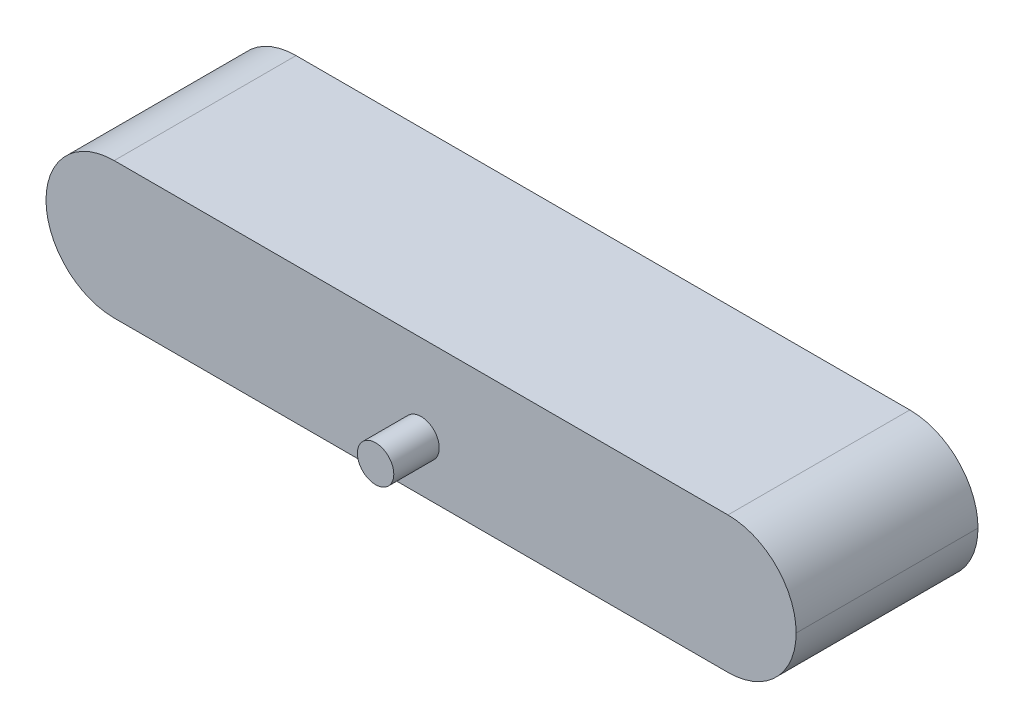
ISO-10303-21;
HEADER;
FILE_DESCRIPTION(('STEP AP214'),'2;1');
FILE_NAME('part.step','',(''),(''),'','','');
FILE_SCHEMA(('AUTOMOTIVE_DESIGN { 1 0 10303 214 1 1 1 1 }'));
ENDSEC;
DATA;
#1=APPLICATION_CONTEXT('core data for automotive mechanical design processes');
#2=APPLICATION_PROTOCOL_DEFINITION('international standard','automotive_design',2000,#1);
#3=PRODUCT_CONTEXT('',#1,'mechanical');
#4=PRODUCT('Part','Part','',(#3));
#5=PRODUCT_RELATED_PRODUCT_CATEGORY('part','',(#4));
#6=PRODUCT_DEFINITION_FORMATION('','',#4);
#7=PRODUCT_DEFINITION_CONTEXT('part definition',#1,'design');
#8=PRODUCT_DEFINITION('design','',#6,#7);
#9=PRODUCT_DEFINITION_SHAPE('','',#8);
#10=(LENGTH_UNIT() NAMED_UNIT(*) SI_UNIT(.MILLI.,.METRE.));
#11=(NAMED_UNIT(*) PLANE_ANGLE_UNIT() SI_UNIT($,.RADIAN.));
#12=(NAMED_UNIT(*) SI_UNIT($,.STERADIAN.) SOLID_ANGLE_UNIT());
#13=UNCERTAINTY_MEASURE_WITH_UNIT(LENGTH_MEASURE(1.E-05),#10,'distance_accuracy_value','');
#14=(GEOMETRIC_REPRESENTATION_CONTEXT(3) GLOBAL_UNCERTAINTY_ASSIGNED_CONTEXT((#13)) GLOBAL_UNIT_ASSIGNED_CONTEXT((#10,
#11,#12)) REPRESENTATION_CONTEXT('',''));
#15=CARTESIAN_POINT('',(0.,0.,0.));
#16=DIRECTION('',(0.,0.,1.));
#17=DIRECTION('',(1.,0.,0.));
#18=AXIS2_PLACEMENT_3D('',#15,#16,#17);
#19=CARTESIAN_POINT('',(82.5,-15.,40.));
#20=DIRECTION('',(0.,1.,0.));
#21=DIRECTION('',(-1.,0.,0.));
#22=AXIS2_PLACEMENT_3D('',#19,#20,#21);
#23=PLANE('',#22);
#24=DIRECTION('',(1.,0.,0.));
#25=VECTOR('',#24,1.);
#26=CARTESIAN_POINT('',(82.5,-15.,0.));
#27=LINE('',#26,#25);
#28=CARTESIAN_POINT('',(-67.5,-15.,0.));
#29=VERTEX_POINT('',#28);
#30=CARTESIAN_POINT('',(67.5,-15.,0.));
#31=VERTEX_POINT('',#30);
#32=EDGE_CURVE('E148',#29,#31,#27,.T.);
#33=ORIENTED_EDGE('',*,*,#32,.T.);
#34=DIRECTION('',(0.,0.,-1.));
#35=VECTOR('',#34,1.);
#36=CARTESIAN_POINT('',(67.5,-15.,40.));
#37=LINE('',#36,#35);
#38=CARTESIAN_POINT('',(67.5,-15.,40.));
#39=VERTEX_POINT('',#38);
#40=EDGE_CURVE('E11',#31,#39,#37,.F.);
#41=ORIENTED_EDGE('',*,*,#40,.T.);
#42=DIRECTION('',(1.,0.,0.));
#43=VECTOR('',#42,1.);
#44=CARTESIAN_POINT('',(82.5,-15.,40.));
#45=LINE('',#44,#43);
#46=CARTESIAN_POINT('',(-67.5,-15.,40.));
#47=VERTEX_POINT('',#46);
#48=EDGE_CURVE('E140',#47,#39,#45,.T.);
#49=ORIENTED_EDGE('',*,*,#48,.F.);
#50=DIRECTION('',(0.,0.,-1.));
#51=VECTOR('',#50,1.);
#52=CARTESIAN_POINT('',(-67.5,-15.,40.));
#53=LINE('',#52,#51);
#54=EDGE_CURVE('E42',#47,#29,#53,.T.);
#55=ORIENTED_EDGE('',*,*,#54,.T.);
#56=EDGE_LOOP('',(#33,#41,#49,#55));
#57=FACE_BOUND('',#56,.T.);
#58=DIRECTION('',(0.,0.,-1.));
#59=VECTOR('',#58,1.);
#60=CARTESIAN_POINT('',(-13.,-15.,7.00000000000001));
#61=LINE('',#60,#59);
#62=CARTESIAN_POINT('',(-13.,-15.,14.));
#63=VERTEX_POINT('',#62);
#64=CARTESIAN_POINT('',(-13.,-15.,7.00000000000001));
#65=VERTEX_POINT('',#64);
#66=EDGE_CURVE('E132',#63,#65,#61,.T.);
#67=ORIENTED_EDGE('',*,*,#66,.F.);
#68=DIRECTION('',(-1.,0.,0.));
#69=VECTOR('',#68,1.);
#70=CARTESIAN_POINT('',(13.,-15.,14.));
#71=LINE('',#70,#69);
#72=CARTESIAN_POINT('',(13.,-15.,14.));
#73=VERTEX_POINT('',#72);
#74=EDGE_CURVE('E129',#73,#63,#71,.T.);
#75=ORIENTED_EDGE('',*,*,#74,.F.);
#76=DIRECTION('',(0.,0.,1.));
#77=VECTOR('',#76,1.);
#78=CARTESIAN_POINT('',(13.,-15.,7.00000000000001));
#79=LINE('',#78,#77);
#80=CARTESIAN_POINT('',(13.,-15.,7.00000000000001));
#81=VERTEX_POINT('',#80);
#82=EDGE_CURVE('E55',#81,#73,#79,.T.);
#83=ORIENTED_EDGE('',*,*,#82,.F.);
#84=DIRECTION('',(1.,0.,0.));
#85=VECTOR('',#84,1.);
#86=CARTESIAN_POINT('',(13.,-15.,7.00000000000001));
#87=LINE('',#86,#85);
#88=EDGE_CURVE('E50',#65,#81,#87,.T.);
#89=ORIENTED_EDGE('',*,*,#88,.F.);
#90=EDGE_LOOP('',(#67,#75,#83,#89));
#91=FACE_BOUND('',#90,.T.);
#92=ADVANCED_FACE('F33',(#57,#91),#23,.F.);
#93=CARTESIAN_POINT('',(82.5,15.,40.));
#94=DIRECTION('',(0.,-1.,0.));
#95=DIRECTION('',(0.,0.,-1.));
#96=AXIS2_PLACEMENT_3D('',#93,#94,#95);
#97=PLANE('',#96);
#98=DIRECTION('',(-1.,0.,0.));
#99=VECTOR('',#98,1.);
#100=CARTESIAN_POINT('',(82.5,15.,0.));
#101=LINE('',#100,#99);
#102=CARTESIAN_POINT('',(67.5,15.,0.));
#103=VERTEX_POINT('',#102);
#104=CARTESIAN_POINT('',(-67.5,15.,0.));
#105=VERTEX_POINT('',#104);
#106=EDGE_CURVE('E144',#103,#105,#101,.T.);
#107=ORIENTED_EDGE('',*,*,#106,.T.);
#108=DIRECTION('',(0.,0.,-1.));
#109=VECTOR('',#108,1.);
#110=CARTESIAN_POINT('',(-67.5,15.,40.));
#111=LINE('',#110,#109);
#112=CARTESIAN_POINT('',(-67.5,15.,40.));
#113=VERTEX_POINT('',#112);
#114=EDGE_CURVE('E162',#105,#113,#111,.F.);
#115=ORIENTED_EDGE('',*,*,#114,.T.);
#116=DIRECTION('',(-1.,0.,0.));
#117=VECTOR('',#116,1.);
#118=CARTESIAN_POINT('',(82.5,15.,40.));
#119=LINE('',#118,#117);
#120=CARTESIAN_POINT('',(67.5,15.,40.));
#121=VERTEX_POINT('',#120);
#122=EDGE_CURVE('E143',#121,#113,#119,.T.);
#123=ORIENTED_EDGE('',*,*,#122,.F.);
#124=DIRECTION('',(0.,0.,-1.));
#125=VECTOR('',#124,1.);
#126=CARTESIAN_POINT('',(67.5,15.,40.));
#127=LINE('',#126,#125);
#128=EDGE_CURVE('E160',#121,#103,#127,.T.);
#129=ORIENTED_EDGE('',*,*,#128,.T.);
#130=EDGE_LOOP('',(#107,#115,#123,#129));
#131=FACE_BOUND('',#130,.T.);
#132=ADVANCED_FACE('F201',(#131),#97,.F.);
#133=CARTESIAN_POINT('',(0.,0.,40.));
#134=DIRECTION('',(0.,0.,1.));
#135=DIRECTION('',(1.,0.,0.));
#136=AXIS2_PLACEMENT_3D('',#133,#134,#135);
#137=PLANE('',#136);
#138=CARTESIAN_POINT('',(0.,-4.,40.));
#139=DIRECTION('',(0.,0.,1.));
#140=DIRECTION('',(1.,0.,0.));
#141=AXIS2_PLACEMENT_3D('',#138,#139,#140);
#142=CIRCLE('',#141,4.);
#143=CARTESIAN_POINT('',(4.,-4.,40.));
#144=VERTEX_POINT('',#143);
#145=EDGE_CURVE('E345',#144,#144,#142,.T.);
#146=ORIENTED_EDGE('',*,*,#145,.F.);
#147=EDGE_LOOP('',(#146));
#148=FACE_BOUND('',#147,.T.);
#149=ORIENTED_EDGE('',*,*,#122,.T.);
#150=CARTESIAN_POINT('',(-67.5,0.,40.));
#151=DIRECTION('',(0.,0.,1.));
#152=DIRECTION('',(1.,0.,0.));
#153=AXIS2_PLACEMENT_3D('',#150,#151,#152);
#154=CIRCLE('',#153,15.);
#155=CARTESIAN_POINT('',(-82.5,0.,40.));
#156=VERTEX_POINT('',#155);
#157=EDGE_CURVE('E171',#113,#156,#154,.T.);
#158=ORIENTED_EDGE('',*,*,#157,.T.);
#159=CARTESIAN_POINT('',(-67.5,0.,40.));
#160=DIRECTION('',(0.,0.,1.));
#161=DIRECTION('',(1.,0.,0.));
#162=AXIS2_PLACEMENT_3D('',#159,#160,#161);
#163=CIRCLE('',#162,15.);
#164=EDGE_CURVE('E169',#156,#47,#163,.T.);
#165=ORIENTED_EDGE('',*,*,#164,.T.);
#166=ORIENTED_EDGE('',*,*,#48,.T.);
#167=CARTESIAN_POINT('',(67.5,0.,40.));
#168=DIRECTION('',(0.,0.,1.));
#169=DIRECTION('',(1.,0.,0.));
#170=AXIS2_PLACEMENT_3D('',#167,#168,#169);
#171=CIRCLE('',#170,15.);
#172=CARTESIAN_POINT('',(82.5,0.,40.));
#173=VERTEX_POINT('',#172);
#174=EDGE_CURVE('E167',#39,#173,#171,.T.);
#175=ORIENTED_EDGE('',*,*,#174,.T.);
#176=CARTESIAN_POINT('',(67.5,0.,40.));
#177=DIRECTION('',(0.,0.,1.));
#178=DIRECTION('',(1.,0.,0.));
#179=AXIS2_PLACEMENT_3D('',#176,#177,#178);
#180=CIRCLE('',#179,15.);
#181=EDGE_CURVE('E165',#173,#121,#180,.T.);
#182=ORIENTED_EDGE('',*,*,#181,.T.);
#183=EDGE_LOOP('',(#149,#158,#165,#166,#175,#182));
#184=FACE_BOUND('',#183,.T.);
#185=ADVANCED_FACE('F186',(#148,#184),#137,.T.);
#186=CARTESIAN_POINT('',(0.,0.,0.));
#187=DIRECTION('',(0.,0.,1.));
#188=DIRECTION('',(1.,0.,0.));
#189=AXIS2_PLACEMENT_3D('',#186,#187,#188);
#190=PLANE('',#189);
#191=CARTESIAN_POINT('',(-67.5,0.,0.));
#192=DIRECTION('',(0.,0.,1.));
#193=DIRECTION('',(1.,0.,0.));
#194=AXIS2_PLACEMENT_3D('',#191,#192,#193);
#195=CIRCLE('',#194,15.);
#196=CARTESIAN_POINT('',(-82.5,0.,0.));
#197=VERTEX_POINT('',#196);
#198=EDGE_CURVE('E156',#29,#197,#195,.F.);
#199=ORIENTED_EDGE('',*,*,#198,.T.);
#200=CARTESIAN_POINT('',(-67.5,0.,0.));
#201=DIRECTION('',(0.,0.,1.));
#202=DIRECTION('',(1.,0.,0.));
#203=AXIS2_PLACEMENT_3D('',#200,#201,#202);
#204=CIRCLE('',#203,15.);
#205=EDGE_CURVE('E158',#197,#105,#204,.F.);
#206=ORIENTED_EDGE('',*,*,#205,.T.);
#207=ORIENTED_EDGE('',*,*,#106,.F.);
#208=CARTESIAN_POINT('',(67.5,0.,0.));
#209=DIRECTION('',(0.,0.,1.));
#210=DIRECTION('',(1.,0.,0.));
#211=AXIS2_PLACEMENT_3D('',#208,#209,#210);
#212=CIRCLE('',#211,15.);
#213=CARTESIAN_POINT('',(82.5,0.,0.));
#214=VERTEX_POINT('',#213);
#215=EDGE_CURVE('E147',#103,#214,#212,.F.);
#216=ORIENTED_EDGE('',*,*,#215,.T.);
#217=CARTESIAN_POINT('',(67.5,0.,0.));
#218=DIRECTION('',(0.,0.,1.));
#219=DIRECTION('',(1.,0.,0.));
#220=AXIS2_PLACEMENT_3D('',#217,#218,#219);
#221=CIRCLE('',#220,15.);
#222=EDGE_CURVE('E154',#214,#31,#221,.F.);
#223=ORIENTED_EDGE('',*,*,#222,.T.);
#224=ORIENTED_EDGE('',*,*,#32,.F.);
#225=EDGE_LOOP('',(#199,#206,#207,#216,#223,#224));
#226=FACE_BOUND('',#225,.T.);
#227=ADVANCED_FACE('F203',(#226),#190,.F.);
#228=CARTESIAN_POINT('',(-67.5,0.,40.));
#229=DIRECTION('',(0.,0.,-1.));
#230=DIRECTION('',(-1.,0.,0.));
#231=AXIS2_PLACEMENT_3D('',#228,#229,#230);
#232=CYLINDRICAL_SURFACE('',#231,15.);
#233=ORIENTED_EDGE('',*,*,#54,.F.);
#234=ORIENTED_EDGE('',*,*,#164,.F.);
#235=DIRECTION('',(0.,0.,-1.));
#236=VECTOR('',#235,1.);
#237=CARTESIAN_POINT('',(-82.5,0.,40.));
#238=LINE('',#237,#236);
#239=EDGE_CURVE('E135',#197,#156,#238,.F.);
#240=ORIENTED_EDGE('',*,*,#239,.F.);
#241=ORIENTED_EDGE('',*,*,#198,.F.);
#242=EDGE_LOOP('',(#233,#234,#240,#241));
#243=FACE_BOUND('',#242,.T.);
#244=ADVANCED_FACE('F183',(#243),#232,.T.);
#245=CARTESIAN_POINT('',(-67.5,0.,40.));
#246=DIRECTION('',(0.,0.,-1.));
#247=DIRECTION('',(-1.,0.,0.));
#248=AXIS2_PLACEMENT_3D('',#245,#246,#247);
#249=CYLINDRICAL_SURFACE('',#248,15.);
#250=ORIENTED_EDGE('',*,*,#157,.F.);
#251=ORIENTED_EDGE('',*,*,#114,.F.);
#252=ORIENTED_EDGE('',*,*,#205,.F.);
#253=ORIENTED_EDGE('',*,*,#239,.T.);
#254=EDGE_LOOP('',(#250,#251,#252,#253));
#255=FACE_BOUND('',#254,.T.);
#256=ADVANCED_FACE('F177',(#255),#249,.T.);
#257=CARTESIAN_POINT('',(67.5,0.,40.));
#258=DIRECTION('',(0.,0.,-1.));
#259=DIRECTION('',(-1.,0.,0.));
#260=AXIS2_PLACEMENT_3D('',#257,#258,#259);
#261=CYLINDRICAL_SURFACE('',#260,15.);
#262=ORIENTED_EDGE('',*,*,#128,.F.);
#263=ORIENTED_EDGE('',*,*,#181,.F.);
#264=DIRECTION('',(0.,0.,-1.));
#265=VECTOR('',#264,1.);
#266=CARTESIAN_POINT('',(82.5,0.,40.));
#267=LINE('',#266,#265);
#268=EDGE_CURVE('E37',#214,#173,#267,.F.);
#269=ORIENTED_EDGE('',*,*,#268,.F.);
#270=ORIENTED_EDGE('',*,*,#215,.F.);
#271=EDGE_LOOP('',(#262,#263,#269,#270));
#272=FACE_BOUND('',#271,.T.);
#273=ADVANCED_FACE('F35',(#272),#261,.T.);
#274=CARTESIAN_POINT('',(67.5,0.,40.));
#275=DIRECTION('',(0.,0.,-1.));
#276=DIRECTION('',(-1.,0.,0.));
#277=AXIS2_PLACEMENT_3D('',#274,#275,#276);
#278=CYLINDRICAL_SURFACE('',#277,15.);
#279=ORIENTED_EDGE('',*,*,#174,.F.);
#280=ORIENTED_EDGE('',*,*,#40,.F.);
#281=ORIENTED_EDGE('',*,*,#222,.F.);
#282=ORIENTED_EDGE('',*,*,#268,.T.);
#283=EDGE_LOOP('',(#279,#280,#281,#282));
#284=FACE_BOUND('',#283,.T.);
#285=ADVANCED_FACE('F192',(#284),#278,.T.);
#286=CARTESIAN_POINT('',(-13.,-21.,7.00000000000001));
#287=DIRECTION('',(1.,0.,0.));
#288=DIRECTION('',(0.,0.,-1.));
#289=AXIS2_PLACEMENT_3D('',#286,#287,#288);
#290=PLANE('',#289);
#291=ORIENTED_EDGE('',*,*,#66,.T.);
#292=DIRECTION('',(0.,1.,0.));
#293=VECTOR('',#292,1.);
#294=CARTESIAN_POINT('',(-13.,-21.,7.00000000000001));
#295=LINE('',#294,#293);
#296=CARTESIAN_POINT('',(-13.,-21.,7.00000000000001));
#297=VERTEX_POINT('',#296);
#298=EDGE_CURVE('E113',#297,#65,#295,.T.);
#299=ORIENTED_EDGE('',*,*,#298,.F.);
#300=DIRECTION('',(0.,0.,-1.));
#301=VECTOR('',#300,1.);
#302=CARTESIAN_POINT('',(-13.,-21.,7.00000000000001));
#303=LINE('',#302,#301);
#304=CARTESIAN_POINT('',(-13.,-21.,14.));
#305=VERTEX_POINT('',#304);
#306=EDGE_CURVE('E120',#305,#297,#303,.T.);
#307=ORIENTED_EDGE('',*,*,#306,.F.);
#308=DIRECTION('',(0.,1.,0.));
#309=VECTOR('',#308,1.);
#310=CARTESIAN_POINT('',(-13.,-21.,14.));
#311=LINE('',#310,#309);
#312=EDGE_CURVE('E336',#305,#63,#311,.T.);
#313=ORIENTED_EDGE('',*,*,#312,.T.);
#314=EDGE_LOOP('',(#291,#299,#307,#313));
#315=FACE_BOUND('',#314,.T.);
#316=ADVANCED_FACE('F131',(#315),#290,.F.);
#317=CARTESIAN_POINT('',(13.,-21.,7.00000000000001));
#318=DIRECTION('',(0.,0.,1.));
#319=DIRECTION('',(1.,0.,0.));
#320=AXIS2_PLACEMENT_3D('',#317,#318,#319);
#321=PLANE('',#320);
#322=ORIENTED_EDGE('',*,*,#88,.T.);
#323=DIRECTION('',(0.,1.,0.));
#324=VECTOR('',#323,1.);
#325=CARTESIAN_POINT('',(13.,-21.,7.00000000000001));
#326=LINE('',#325,#324);
#327=CARTESIAN_POINT('',(13.,-21.,7.00000000000001));
#328=VERTEX_POINT('',#327);
#329=EDGE_CURVE('E116',#328,#81,#326,.T.);
#330=ORIENTED_EDGE('',*,*,#329,.F.);
#331=DIRECTION('',(1.,0.,0.));
#332=VECTOR('',#331,1.);
#333=CARTESIAN_POINT('',(13.,-21.,7.00000000000001));
#334=LINE('',#333,#332);
#335=EDGE_CURVE('E109',#297,#328,#334,.T.);
#336=ORIENTED_EDGE('',*,*,#335,.F.);
#337=ORIENTED_EDGE('',*,*,#298,.T.);
#338=EDGE_LOOP('',(#322,#330,#336,#337));
#339=FACE_BOUND('',#338,.T.);
#340=ADVANCED_FACE('F111',(#339),#321,.F.);
#341=CARTESIAN_POINT('',(13.,-21.,7.00000000000001));
#342=DIRECTION('',(-1.,0.,0.));
#343=DIRECTION('',(0.,0.,1.));
#344=AXIS2_PLACEMENT_3D('',#341,#342,#343);
#345=PLANE('',#344);
#346=ORIENTED_EDGE('',*,*,#82,.T.);
#347=DIRECTION('',(0.,1.,0.));
#348=VECTOR('',#347,1.);
#349=CARTESIAN_POINT('',(13.,-21.,14.));
#350=LINE('',#349,#348);
#351=CARTESIAN_POINT('',(13.,-21.,14.));
#352=VERTEX_POINT('',#351);
#353=EDGE_CURVE('E136',#352,#73,#350,.T.);
#354=ORIENTED_EDGE('',*,*,#353,.F.);
#355=DIRECTION('',(0.,0.,1.));
#356=VECTOR('',#355,1.);
#357=CARTESIAN_POINT('',(13.,-21.,7.00000000000001));
#358=LINE('',#357,#356);
#359=EDGE_CURVE('E119',#328,#352,#358,.T.);
#360=ORIENTED_EDGE('',*,*,#359,.F.);
#361=ORIENTED_EDGE('',*,*,#329,.T.);
#362=EDGE_LOOP('',(#346,#354,#360,#361));
#363=FACE_BOUND('',#362,.T.);
#364=ADVANCED_FACE('F288',(#363),#345,.F.);
#365=CARTESIAN_POINT('',(13.,-21.,14.));
#366=DIRECTION('',(0.,0.,-1.));
#367=DIRECTION('',(-1.,0.,0.));
#368=AXIS2_PLACEMENT_3D('',#365,#366,#367);
#369=PLANE('',#368);
#370=ORIENTED_EDGE('',*,*,#74,.T.);
#371=ORIENTED_EDGE('',*,*,#312,.F.);
#372=DIRECTION('',(-1.,0.,0.));
#373=VECTOR('',#372,1.);
#374=CARTESIAN_POINT('',(13.,-21.,14.));
#375=LINE('',#374,#373);
#376=EDGE_CURVE('E125',#352,#305,#375,.T.);
#377=ORIENTED_EDGE('',*,*,#376,.F.);
#378=ORIENTED_EDGE('',*,*,#353,.T.);
#379=EDGE_LOOP('',(#370,#371,#377,#378));
#380=FACE_BOUND('',#379,.T.);
#381=ADVANCED_FACE('F285',(#380),#369,.F.);
#382=CARTESIAN_POINT('',(0.,-21.,0.));
#383=DIRECTION('',(0.,-1.,0.));
#384=DIRECTION('',(1.,0.,0.));
#385=AXIS2_PLACEMENT_3D('',#382,#383,#384);
#386=PLANE('',#385);
#387=ORIENTED_EDGE('',*,*,#306,.T.);
#388=ORIENTED_EDGE('',*,*,#335,.T.);
#389=ORIENTED_EDGE('',*,*,#359,.T.);
#390=ORIENTED_EDGE('',*,*,#376,.T.);
#391=EDGE_LOOP('',(#387,#388,#389,#390));
#392=FACE_BOUND('',#391,.T.);
#393=ADVANCED_FACE('F123',(#392),#386,.T.);
#394=CARTESIAN_POINT('',(0.,-4.,50.));
#395=DIRECTION('',(0.,0.,-1.));
#396=DIRECTION('',(-1.,0.,0.));
#397=AXIS2_PLACEMENT_3D('',#394,#395,#396);
#398=CYLINDRICAL_SURFACE('',#397,4.);
#399=CARTESIAN_POINT('',(0.,-4.,50.));
#400=DIRECTION('',(0.,0.,1.));
#401=DIRECTION('',(1.,0.,0.));
#402=AXIS2_PLACEMENT_3D('',#399,#400,#401);
#403=CIRCLE('',#402,4.);
#404=CARTESIAN_POINT('',(4.,-4.,50.));
#405=VERTEX_POINT('',#404);
#406=EDGE_CURVE('E342',#405,#405,#403,.T.);
#407=ORIENTED_EDGE('',*,*,#406,.F.);
#408=EDGE_LOOP('',(#407));
#409=FACE_BOUND('',#408,.T.);
#410=ORIENTED_EDGE('',*,*,#145,.T.);
#411=EDGE_LOOP('',(#410));
#412=FACE_BOUND('',#411,.T.);
#413=ADVANCED_FACE('F263',(#409,#412),#398,.T.);
#414=CARTESIAN_POINT('',(0.,-4.,50.));
#415=DIRECTION('',(0.,0.,1.));
#416=DIRECTION('',(1.,0.,0.));
#417=AXIS2_PLACEMENT_3D('',#414,#415,#416);
#418=PLANE('',#417);
#419=ORIENTED_EDGE('',*,*,#406,.T.);
#420=EDGE_LOOP('',(#419));
#421=FACE_BOUND('',#420,.T.);
#422=ADVANCED_FACE('F268',(#421),#418,.T.);
#423=CLOSED_SHELL('',(#92,#132,#185,#227,#244,#256,#273,#285,#316,#340,#364,#381,#393,#413,#422));
#424=MANIFOLD_SOLID_BREP('B2',#423);
#425=ADVANCED_BREP_SHAPE_REPRESENTATION('',(#18,#424),#14);
#426=SHAPE_DEFINITION_REPRESENTATION(#9,#425);
ENDSEC;
END-ISO-10303-21;
